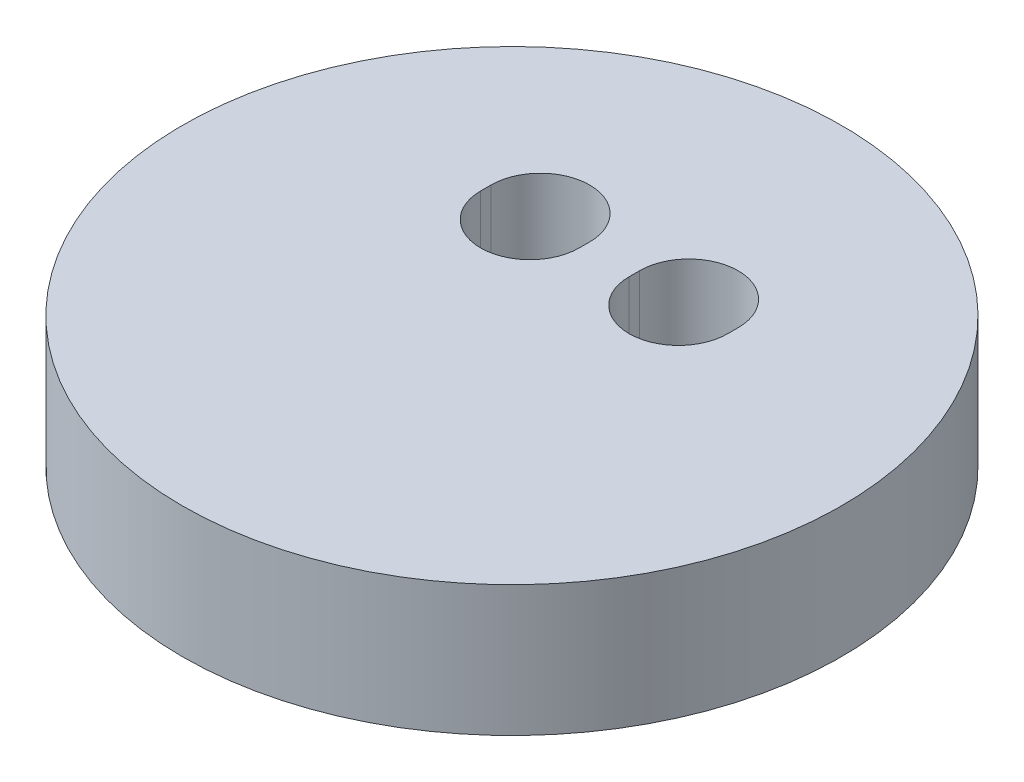
ISO-10303-21;
HEADER;
FILE_DESCRIPTION(('STEP AP214'),'2;1');
FILE_NAME('part.step','',(''),(''),'','','');
FILE_SCHEMA(('AUTOMOTIVE_DESIGN { 1 0 10303 214 1 1 1 1 }'));
ENDSEC;
DATA;
#1=APPLICATION_CONTEXT('core data for automotive mechanical design processes');
#2=APPLICATION_PROTOCOL_DEFINITION('international standard','automotive_design',2000,#1);
#3=PRODUCT_CONTEXT('',#1,'mechanical');
#4=PRODUCT('Part','Part','',(#3));
#5=PRODUCT_RELATED_PRODUCT_CATEGORY('part','',(#4));
#6=PRODUCT_DEFINITION_FORMATION('','',#4);
#7=PRODUCT_DEFINITION_CONTEXT('part definition',#1,'design');
#8=PRODUCT_DEFINITION('design','',#6,#7);
#9=PRODUCT_DEFINITION_SHAPE('','',#8);
#10=(LENGTH_UNIT() NAMED_UNIT(*) SI_UNIT(.MILLI.,.METRE.));
#11=(NAMED_UNIT(*) PLANE_ANGLE_UNIT() SI_UNIT($,.RADIAN.));
#12=(NAMED_UNIT(*) SI_UNIT($,.STERADIAN.) SOLID_ANGLE_UNIT());
#13=UNCERTAINTY_MEASURE_WITH_UNIT(LENGTH_MEASURE(1.E-05),#10,'distance_accuracy_value','');
#14=(GEOMETRIC_REPRESENTATION_CONTEXT(3) GLOBAL_UNCERTAINTY_ASSIGNED_CONTEXT((#13)) GLOBAL_UNIT_ASSIGNED_CONTEXT((#10,
#11,#12)) REPRESENTATION_CONTEXT('',''));
#15=CARTESIAN_POINT('',(0.,0.,0.));
#16=DIRECTION('',(0.,0.,1.));
#17=DIRECTION('',(1.,0.,0.));
#18=AXIS2_PLACEMENT_3D('',#15,#16,#17);
#19=CARTESIAN_POINT('',(0.,4.9,0.));
#20=DIRECTION('',(0.,-1.,0.));
#21=DIRECTION('',(0.,0.,-1.));
#22=AXIS2_PLACEMENT_3D('',#19,#20,#21);
#23=CYLINDRICAL_SURFACE('',#22,12.36);
#24=CARTESIAN_POINT('',(0.,4.9,0.));
#25=DIRECTION('',(0.,1.,0.));
#26=DIRECTION('',(0.,0.,1.));
#27=AXIS2_PLACEMENT_3D('',#24,#25,#26);
#28=CIRCLE('',#27,12.36);
#29=CARTESIAN_POINT('',(0.,4.9,12.36));
#30=VERTEX_POINT('',#29);
#31=EDGE_CURVE('E11',#30,#30,#28,.T.);
#32=ORIENTED_EDGE('',*,*,#31,.F.);
#33=EDGE_LOOP('',(#32));
#34=FACE_BOUND('',#33,.T.);
#35=CARTESIAN_POINT('',(0.,0.,0.));
#36=DIRECTION('',(0.,1.,0.));
#37=DIRECTION('',(0.,0.,1.));
#38=AXIS2_PLACEMENT_3D('',#35,#36,#37);
#39=CIRCLE('',#38,12.36);
#40=CARTESIAN_POINT('',(0.,0.,12.36));
#41=VERTEX_POINT('',#40);
#42=EDGE_CURVE('E46',#41,#41,#39,.T.);
#43=ORIENTED_EDGE('',*,*,#42,.T.);
#44=EDGE_LOOP('',(#43));
#45=FACE_BOUND('',#44,.T.);
#46=ADVANCED_FACE('F43',(#34,#45),#23,.T.);
#47=CARTESIAN_POINT('',(0.,4.9,0.));
#48=DIRECTION('',(0.,1.,0.));
#49=DIRECTION('',(0.,0.,1.));
#50=AXIS2_PLACEMENT_3D('',#47,#48,#49);
#51=PLANE('',#50);
#52=CARTESIAN_POINT('',(-2.785,4.9,-3.85));
#53=DIRECTION('',(0.,1.,0.));
#54=DIRECTION('',(0.,0.,1.));
#55=AXIS2_PLACEMENT_3D('',#52,#53,#54);
#56=CIRCLE('',#55,1.85);
#57=CARTESIAN_POINT('',(-0.935000000000001,4.9,-3.85));
#58=VERTEX_POINT('',#57);
#59=CARTESIAN_POINT('',(-4.635,4.9,-3.85));
#60=VERTEX_POINT('',#59);
#61=EDGE_CURVE('E58',#58,#60,#56,.T.);
#62=ORIENTED_EDGE('',*,*,#61,.F.);
#63=DIRECTION('',(0.,0.,-1.));
#64=VECTOR('',#63,1.);
#65=CARTESIAN_POINT('',(-0.935000000000001,4.9,-3.85));
#66=LINE('',#65,#64);
#67=CARTESIAN_POINT('',(-0.935000000000001,4.9,-3.46000000000001));
#68=VERTEX_POINT('',#67);
#69=EDGE_CURVE('E132',#68,#58,#66,.T.);
#70=ORIENTED_EDGE('',*,*,#69,.F.);
#71=CARTESIAN_POINT('',(-2.785,4.9,-3.46));
#72=DIRECTION('',(0.,1.,0.));
#73=DIRECTION('',(0.,0.,1.));
#74=AXIS2_PLACEMENT_3D('',#71,#72,#73);
#75=CIRCLE('',#74,1.85);
#76=CARTESIAN_POINT('',(-4.635,4.9,-3.46));
#77=VERTEX_POINT('',#76);
#78=EDGE_CURVE('E136',#77,#68,#75,.T.);
#79=ORIENTED_EDGE('',*,*,#78,.F.);
#80=DIRECTION('',(0.,0.,1.));
#81=VECTOR('',#80,1.);
#82=CARTESIAN_POINT('',(-4.635,4.9,-3.85));
#83=LINE('',#82,#81);
#84=EDGE_CURVE('E145',#60,#77,#83,.T.);
#85=ORIENTED_EDGE('',*,*,#84,.F.);
#86=EDGE_LOOP('',(#62,#70,#79,#85));
#87=FACE_BOUND('',#86,.T.);
#88=CARTESIAN_POINT('',(2.785,4.9,-3.85));
#89=DIRECTION('',(0.,1.,0.));
#90=DIRECTION('',(0.,0.,1.));
#91=AXIS2_PLACEMENT_3D('',#88,#89,#90);
#92=CIRCLE('',#91,1.85);
#93=CARTESIAN_POINT('',(4.635,4.9,-3.85));
#94=VERTEX_POINT('',#93);
#95=CARTESIAN_POINT('',(0.934999999999997,4.9,-3.85));
#96=VERTEX_POINT('',#95);
#97=EDGE_CURVE('E66',#94,#96,#92,.T.);
#98=ORIENTED_EDGE('',*,*,#97,.F.);
#99=DIRECTION('',(0.,0.,-1.));
#100=VECTOR('',#99,1.);
#101=CARTESIAN_POINT('',(4.635,4.9,-3.85));
#102=LINE('',#101,#100);
#103=CARTESIAN_POINT('',(4.635,4.9,-3.46));
#104=VERTEX_POINT('',#103);
#105=EDGE_CURVE('E172',#104,#94,#102,.T.);
#106=ORIENTED_EDGE('',*,*,#105,.F.);
#107=CARTESIAN_POINT('',(2.785,4.9,-3.46));
#108=DIRECTION('',(0.,1.,0.));
#109=DIRECTION('',(0.,0.,1.));
#110=AXIS2_PLACEMENT_3D('',#107,#108,#109);
#111=CIRCLE('',#110,1.85);
#112=CARTESIAN_POINT('',(0.934999999999996,4.9,-3.46));
#113=VERTEX_POINT('',#112);
#114=EDGE_CURVE('E176',#113,#104,#111,.T.);
#115=ORIENTED_EDGE('',*,*,#114,.F.);
#116=DIRECTION('',(0.,0.,1.));
#117=VECTOR('',#116,1.);
#118=CARTESIAN_POINT('',(0.934999999999997,4.9,-3.85));
#119=LINE('',#118,#117);
#120=EDGE_CURVE('E181',#96,#113,#119,.T.);
#121=ORIENTED_EDGE('',*,*,#120,.F.);
#122=EDGE_LOOP('',(#98,#106,#115,#121));
#123=FACE_BOUND('',#122,.T.);
#124=ORIENTED_EDGE('',*,*,#31,.T.);
#125=EDGE_LOOP('',(#124));
#126=FACE_BOUND('',#125,.T.);
#127=ADVANCED_FACE('F216',(#87,#123,#126),#51,.T.);
#128=CARTESIAN_POINT('',(0.,0.,0.));
#129=DIRECTION('',(0.,1.,0.));
#130=DIRECTION('',(0.,0.,1.));
#131=AXIS2_PLACEMENT_3D('',#128,#129,#130);
#132=PLANE('',#131);
#133=DIRECTION('',(0.,0.,-1.));
#134=VECTOR('',#133,1.);
#135=CARTESIAN_POINT('',(-0.935000000000001,0.,-3.85));
#136=LINE('',#135,#134);
#137=CARTESIAN_POINT('',(-0.935000000000001,0.,-3.46000000000001));
#138=VERTEX_POINT('',#137);
#139=CARTESIAN_POINT('',(-0.935000000000001,0.,-3.85));
#140=VERTEX_POINT('',#139);
#141=EDGE_CURVE('E117',#138,#140,#136,.T.);
#142=ORIENTED_EDGE('',*,*,#141,.T.);
#143=CARTESIAN_POINT('',(-2.785,0.,-3.85));
#144=DIRECTION('',(0.,1.,0.));
#145=DIRECTION('',(0.,0.,1.));
#146=AXIS2_PLACEMENT_3D('',#143,#144,#145);
#147=CIRCLE('',#146,1.85);
#148=CARTESIAN_POINT('',(-4.635,0.,-3.85));
#149=VERTEX_POINT('',#148);
#150=EDGE_CURVE('E110',#140,#149,#147,.T.);
#151=ORIENTED_EDGE('',*,*,#150,.T.);
#152=DIRECTION('',(0.,0.,1.));
#153=VECTOR('',#152,1.);
#154=CARTESIAN_POINT('',(-4.635,0.,-3.85));
#155=LINE('',#154,#153);
#156=CARTESIAN_POINT('',(-4.635,0.,-3.46));
#157=VERTEX_POINT('',#156);
#158=EDGE_CURVE('E121',#149,#157,#155,.T.);
#159=ORIENTED_EDGE('',*,*,#158,.T.);
#160=CARTESIAN_POINT('',(-2.785,0.,-3.46));
#161=DIRECTION('',(0.,1.,0.));
#162=DIRECTION('',(0.,0.,1.));
#163=AXIS2_PLACEMENT_3D('',#160,#161,#162);
#164=CIRCLE('',#163,1.85);
#165=EDGE_CURVE('E126',#157,#138,#164,.T.);
#166=ORIENTED_EDGE('',*,*,#165,.T.);
#167=EDGE_LOOP('',(#142,#151,#159,#166));
#168=FACE_BOUND('',#167,.T.);
#169=DIRECTION('',(0.,0.,-1.));
#170=VECTOR('',#169,1.);
#171=CARTESIAN_POINT('',(4.635,0.,-3.85));
#172=LINE('',#171,#170);
#173=CARTESIAN_POINT('',(4.635,0.,-3.46));
#174=VERTEX_POINT('',#173);
#175=CARTESIAN_POINT('',(4.635,0.,-3.85));
#176=VERTEX_POINT('',#175);
#177=EDGE_CURVE('E162',#174,#176,#172,.T.);
#178=ORIENTED_EDGE('',*,*,#177,.T.);
#179=CARTESIAN_POINT('',(2.785,0.,-3.85));
#180=DIRECTION('',(0.,1.,0.));
#181=DIRECTION('',(0.,0.,1.));
#182=AXIS2_PLACEMENT_3D('',#179,#180,#181);
#183=CIRCLE('',#182,1.85);
#184=CARTESIAN_POINT('',(0.934999999999997,0.,-3.85));
#185=VERTEX_POINT('',#184);
#186=EDGE_CURVE('E177',#176,#185,#183,.T.);
#187=ORIENTED_EDGE('',*,*,#186,.T.);
#188=DIRECTION('',(0.,0.,1.));
#189=VECTOR('',#188,1.);
#190=CARTESIAN_POINT('',(0.934999999999997,0.,-3.85));
#191=LINE('',#190,#189);
#192=CARTESIAN_POINT('',(0.934999999999997,0.,-3.46));
#193=VERTEX_POINT('',#192);
#194=EDGE_CURVE('E194',#185,#193,#191,.T.);
#195=ORIENTED_EDGE('',*,*,#194,.T.);
#196=CARTESIAN_POINT('',(2.785,0.,-3.46));
#197=DIRECTION('',(0.,1.,0.));
#198=DIRECTION('',(0.,0.,1.));
#199=AXIS2_PLACEMENT_3D('',#196,#197,#198);
#200=CIRCLE('',#199,1.85);
#201=EDGE_CURVE('E190',#193,#174,#200,.T.);
#202=ORIENTED_EDGE('',*,*,#201,.T.);
#203=EDGE_LOOP('',(#178,#187,#195,#202));
#204=FACE_BOUND('',#203,.T.);
#205=ORIENTED_EDGE('',*,*,#42,.F.);
#206=EDGE_LOOP('',(#205));
#207=FACE_BOUND('',#206,.T.);
#208=ADVANCED_FACE('F128',(#168,#204,#207),#132,.F.);
#209=CARTESIAN_POINT('',(2.785,0.,-3.85));
#210=DIRECTION('',(0.,1.,0.));
#211=DIRECTION('',(0.,0.,1.));
#212=AXIS2_PLACEMENT_3D('',#209,#210,#211);
#213=CYLINDRICAL_SURFACE('',#212,1.85);
#214=ORIENTED_EDGE('',*,*,#97,.T.);
#215=DIRECTION('',(0.,1.,0.));
#216=VECTOR('',#215,1.);
#217=CARTESIAN_POINT('',(0.934999999999997,0.,-3.85));
#218=LINE('',#217,#216);
#219=EDGE_CURVE('E159',#185,#96,#218,.T.);
#220=ORIENTED_EDGE('',*,*,#219,.F.);
#221=ORIENTED_EDGE('',*,*,#186,.F.);
#222=DIRECTION('',(0.,1.,0.));
#223=VECTOR('',#222,1.);
#224=CARTESIAN_POINT('',(4.635,0.,-3.85));
#225=LINE('',#224,#223);
#226=EDGE_CURVE('E169',#176,#94,#225,.T.);
#227=ORIENTED_EDGE('',*,*,#226,.T.);
#228=EDGE_LOOP('',(#214,#220,#221,#227));
#229=FACE_BOUND('',#228,.T.);
#230=ADVANCED_FACE('F204',(#229),#213,.F.);
#231=CARTESIAN_POINT('',(4.635,0.,-3.85));
#232=DIRECTION('',(1.,0.,0.));
#233=DIRECTION('',(0.,0.,-1.));
#234=AXIS2_PLACEMENT_3D('',#231,#232,#233);
#235=PLANE('',#234);
#236=ORIENTED_EDGE('',*,*,#105,.T.);
#237=ORIENTED_EDGE('',*,*,#226,.F.);
#238=ORIENTED_EDGE('',*,*,#177,.F.);
#239=DIRECTION('',(0.,1.,0.));
#240=VECTOR('',#239,1.);
#241=CARTESIAN_POINT('',(4.635,0.,-3.46));
#242=LINE('',#241,#240);
#243=EDGE_CURVE('E166',#174,#104,#242,.T.);
#244=ORIENTED_EDGE('',*,*,#243,.T.);
#245=EDGE_LOOP('',(#236,#237,#238,#244));
#246=FACE_BOUND('',#245,.T.);
#247=ADVANCED_FACE('F214',(#246),#235,.F.);
#248=CARTESIAN_POINT('',(2.785,0.,-3.46));
#249=DIRECTION('',(0.,1.,0.));
#250=DIRECTION('',(0.,0.,1.));
#251=AXIS2_PLACEMENT_3D('',#248,#249,#250);
#252=CYLINDRICAL_SURFACE('',#251,1.85);
#253=ORIENTED_EDGE('',*,*,#114,.T.);
#254=ORIENTED_EDGE('',*,*,#243,.F.);
#255=ORIENTED_EDGE('',*,*,#201,.F.);
#256=DIRECTION('',(0.,1.,0.));
#257=VECTOR('',#256,1.);
#258=CARTESIAN_POINT('',(0.934999999999996,0.,-3.46));
#259=LINE('',#258,#257);
#260=EDGE_CURVE('E163',#193,#113,#259,.T.);
#261=ORIENTED_EDGE('',*,*,#260,.T.);
#262=EDGE_LOOP('',(#253,#254,#255,#261));
#263=FACE_BOUND('',#262,.T.);
#264=ADVANCED_FACE('F211',(#263),#252,.F.);
#265=CARTESIAN_POINT('',(0.934999999999997,0.,-3.85));
#266=DIRECTION('',(-1.,0.,0.));
#267=DIRECTION('',(0.,0.,1.));
#268=AXIS2_PLACEMENT_3D('',#265,#266,#267);
#269=PLANE('',#268);
#270=ORIENTED_EDGE('',*,*,#120,.T.);
#271=ORIENTED_EDGE('',*,*,#260,.F.);
#272=ORIENTED_EDGE('',*,*,#194,.F.);
#273=ORIENTED_EDGE('',*,*,#219,.T.);
#274=EDGE_LOOP('',(#270,#271,#272,#273));
#275=FACE_BOUND('',#274,.T.);
#276=ADVANCED_FACE('F208',(#275),#269,.F.);
#277=CARTESIAN_POINT('',(-2.785,0.,-3.85));
#278=DIRECTION('',(0.,1.,0.));
#279=DIRECTION('',(0.,0.,1.));
#280=AXIS2_PLACEMENT_3D('',#277,#278,#279);
#281=CYLINDRICAL_SURFACE('',#280,1.85);
#282=ORIENTED_EDGE('',*,*,#61,.T.);
#283=DIRECTION('',(0.,1.,0.));
#284=VECTOR('',#283,1.);
#285=CARTESIAN_POINT('',(-4.635,0.,-3.85));
#286=LINE('',#285,#284);
#287=EDGE_CURVE('E106',#149,#60,#286,.T.);
#288=ORIENTED_EDGE('',*,*,#287,.F.);
#289=ORIENTED_EDGE('',*,*,#150,.F.);
#290=DIRECTION('',(0.,1.,0.));
#291=VECTOR('',#290,1.);
#292=CARTESIAN_POINT('',(-0.935000000000001,0.,-3.85));
#293=LINE('',#292,#291);
#294=EDGE_CURVE('E151',#140,#58,#293,.T.);
#295=ORIENTED_EDGE('',*,*,#294,.T.);
#296=EDGE_LOOP('',(#282,#288,#289,#295));
#297=FACE_BOUND('',#296,.T.);
#298=ADVANCED_FACE('F108',(#297),#281,.F.);
#299=CARTESIAN_POINT('',(-0.935000000000001,0.,-3.85));
#300=DIRECTION('',(1.,0.,0.));
#301=DIRECTION('',(0.,0.,-1.));
#302=AXIS2_PLACEMENT_3D('',#299,#300,#301);
#303=PLANE('',#302);
#304=ORIENTED_EDGE('',*,*,#69,.T.);
#305=ORIENTED_EDGE('',*,*,#294,.F.);
#306=ORIENTED_EDGE('',*,*,#141,.F.);
#307=DIRECTION('',(0.,1.,0.));
#308=VECTOR('',#307,1.);
#309=CARTESIAN_POINT('',(-0.935000000000001,0.,-3.46000000000001));
#310=LINE('',#309,#308);
#311=EDGE_CURVE('E154',#138,#68,#310,.T.);
#312=ORIENTED_EDGE('',*,*,#311,.T.);
#313=EDGE_LOOP('',(#304,#305,#306,#312));
#314=FACE_BOUND('',#313,.T.);
#315=ADVANCED_FACE('F242',(#314),#303,.F.);
#316=CARTESIAN_POINT('',(-2.785,0.,-3.46));
#317=DIRECTION('',(0.,1.,0.));
#318=DIRECTION('',(0.,0.,1.));
#319=AXIS2_PLACEMENT_3D('',#316,#317,#318);
#320=CYLINDRICAL_SURFACE('',#319,1.85);
#321=ORIENTED_EDGE('',*,*,#78,.T.);
#322=ORIENTED_EDGE('',*,*,#311,.F.);
#323=ORIENTED_EDGE('',*,*,#165,.F.);
#324=DIRECTION('',(0.,1.,0.));
#325=VECTOR('',#324,1.);
#326=CARTESIAN_POINT('',(-4.635,0.,-3.46));
#327=LINE('',#326,#325);
#328=EDGE_CURVE('E116',#157,#77,#327,.T.);
#329=ORIENTED_EDGE('',*,*,#328,.T.);
#330=EDGE_LOOP('',(#321,#322,#323,#329));
#331=FACE_BOUND('',#330,.T.);
#332=ADVANCED_FACE('F245',(#331),#320,.F.);
#333=CARTESIAN_POINT('',(-4.635,0.,-3.85));
#334=DIRECTION('',(-1.,0.,0.));
#335=DIRECTION('',(0.,0.,1.));
#336=AXIS2_PLACEMENT_3D('',#333,#334,#335);
#337=PLANE('',#336);
#338=ORIENTED_EDGE('',*,*,#84,.T.);
#339=ORIENTED_EDGE('',*,*,#328,.F.);
#340=ORIENTED_EDGE('',*,*,#158,.F.);
#341=ORIENTED_EDGE('',*,*,#287,.T.);
#342=EDGE_LOOP('',(#338,#339,#340,#341));
#343=FACE_BOUND('',#342,.T.);
#344=ADVANCED_FACE('F122',(#343),#337,.F.);
#345=CLOSED_SHELL('',(#46,#127,#208,#230,#247,#264,#276,#298,#315,#332,#344));
#346=MANIFOLD_SOLID_BREP('B2',#345);
#347=ADVANCED_BREP_SHAPE_REPRESENTATION('',(#18,#346),#14);
#348=SHAPE_DEFINITION_REPRESENTATION(#9,#347);
ENDSEC;
END-ISO-10303-21;
